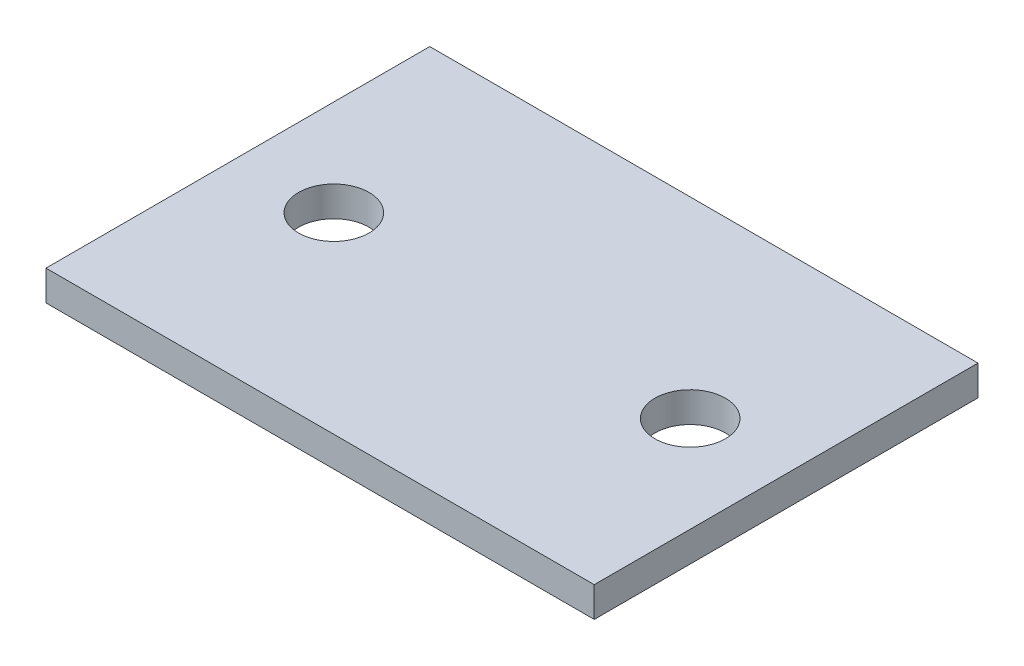
ISO-10303-21;
HEADER;
FILE_DESCRIPTION(('STEP AP214'),'2;1');
FILE_NAME('part.step','',(''),(''),'','','');
FILE_SCHEMA(('AUTOMOTIVE_DESIGN { 1 0 10303 214 1 1 1 1 }'));
ENDSEC;
DATA;
#1=APPLICATION_CONTEXT('core data for automotive mechanical design processes');
#2=APPLICATION_PROTOCOL_DEFINITION('international standard','automotive_design',2000,#1);
#3=PRODUCT_CONTEXT('',#1,'mechanical');
#4=PRODUCT('Part','Part','',(#3));
#5=PRODUCT_RELATED_PRODUCT_CATEGORY('part','',(#4));
#6=PRODUCT_DEFINITION_FORMATION('','',#4);
#7=PRODUCT_DEFINITION_CONTEXT('part definition',#1,'design');
#8=PRODUCT_DEFINITION('design','',#6,#7);
#9=PRODUCT_DEFINITION_SHAPE('','',#8);
#10=(LENGTH_UNIT() NAMED_UNIT(*) SI_UNIT(.MILLI.,.METRE.));
#11=(NAMED_UNIT(*) PLANE_ANGLE_UNIT() SI_UNIT($,.RADIAN.));
#12=(NAMED_UNIT(*) SI_UNIT($,.STERADIAN.) SOLID_ANGLE_UNIT());
#13=UNCERTAINTY_MEASURE_WITH_UNIT(LENGTH_MEASURE(1.E-05),#10,'distance_accuracy_value','');
#14=(GEOMETRIC_REPRESENTATION_CONTEXT(3) GLOBAL_UNCERTAINTY_ASSIGNED_CONTEXT((#13)) GLOBAL_UNIT_ASSIGNED_CONTEXT((#10,
#11,#12)) REPRESENTATION_CONTEXT('',''));
#15=CARTESIAN_POINT('',(0.,0.,0.));
#16=DIRECTION('',(0.,0.,1.));
#17=DIRECTION('',(1.,0.,0.));
#18=AXIS2_PLACEMENT_3D('',#15,#16,#17);
#19=CARTESIAN_POINT('',(0.,2.794,0.));
#20=DIRECTION('',(0.,1.,0.));
#21=DIRECTION('',(0.,0.,1.));
#22=AXIS2_PLACEMENT_3D('',#19,#20,#21);
#23=PLANE('',#22);
#24=CARTESIAN_POINT('',(-16.51,2.794,0.));
#25=DIRECTION('',(0.,1.,0.));
#26=DIRECTION('',(0.,0.,1.));
#27=AXIS2_PLACEMENT_3D('',#24,#25,#26);
#28=CIRCLE('',#27,3.2639);
#29=CARTESIAN_POINT('',(-16.51,2.794,3.2639));
#30=VERTEX_POINT('',#29);
#31=EDGE_CURVE('E124',#30,#30,#28,.T.);
#32=ORIENTED_EDGE('',*,*,#31,.F.);
#33=EDGE_LOOP('',(#32));
#34=FACE_BOUND('',#33,.T.);
#35=DIRECTION('',(0.,0.,1.));
#36=VECTOR('',#35,1.);
#37=CARTESIAN_POINT('',(-25.4,2.794,-17.78));
#38=LINE('',#37,#36);
#39=CARTESIAN_POINT('',(-25.4,2.794,-17.78));
#40=VERTEX_POINT('',#39);
#41=CARTESIAN_POINT('',(-25.4,2.794,17.78));
#42=VERTEX_POINT('',#41);
#43=EDGE_CURVE('E102',#40,#42,#38,.T.);
#44=ORIENTED_EDGE('',*,*,#43,.T.);
#45=DIRECTION('',(1.,0.,0.));
#46=VECTOR('',#45,1.);
#47=CARTESIAN_POINT('',(-25.4,2.794,17.78));
#48=LINE('',#47,#46);
#49=CARTESIAN_POINT('',(25.4,2.794,17.78));
#50=VERTEX_POINT('',#49);
#51=EDGE_CURVE('E97',#42,#50,#48,.T.);
#52=ORIENTED_EDGE('',*,*,#51,.T.);
#53=DIRECTION('',(0.,0.,-1.));
#54=VECTOR('',#53,1.);
#55=CARTESIAN_POINT('',(25.4,2.794,-17.78));
#56=LINE('',#55,#54);
#57=CARTESIAN_POINT('',(25.4,2.794,-17.78));
#58=VERTEX_POINT('',#57);
#59=EDGE_CURVE('E100',#50,#58,#56,.T.);
#60=ORIENTED_EDGE('',*,*,#59,.T.);
#61=DIRECTION('',(-1.,0.,0.));
#62=VECTOR('',#61,1.);
#63=CARTESIAN_POINT('',(-25.4,2.794,-17.78));
#64=LINE('',#63,#62);
#65=EDGE_CURVE('E67',#58,#40,#64,.T.);
#66=ORIENTED_EDGE('',*,*,#65,.T.);
#67=EDGE_LOOP('',(#44,#52,#60,#66));
#68=FACE_BOUND('',#67,.T.);
#69=CARTESIAN_POINT('',(16.51,2.794,0.));
#70=DIRECTION('',(0.,1.,0.));
#71=DIRECTION('',(0.,0.,-1.));
#72=AXIS2_PLACEMENT_3D('',#69,#70,#71);
#73=CIRCLE('',#72,3.2639);
#74=CARTESIAN_POINT('',(16.51,2.794,-3.2639));
#75=VERTEX_POINT('',#74);
#76=EDGE_CURVE('E137',#75,#75,#73,.T.);
#77=ORIENTED_EDGE('',*,*,#76,.F.);
#78=EDGE_LOOP('',(#77));
#79=FACE_BOUND('',#78,.T.);
#80=ADVANCED_FACE('F49',(#34,#68,#79),#23,.T.);
#81=CARTESIAN_POINT('',(0.,0.,0.));
#82=DIRECTION('',(0.,1.,0.));
#83=DIRECTION('',(0.,0.,1.));
#84=AXIS2_PLACEMENT_3D('',#81,#82,#83);
#85=PLANE('',#84);
#86=DIRECTION('',(0.,0.,1.));
#87=VECTOR('',#86,1.);
#88=CARTESIAN_POINT('',(-25.4,0.,-17.78));
#89=LINE('',#88,#87);
#90=CARTESIAN_POINT('',(-25.4,0.,-17.78));
#91=VERTEX_POINT('',#90);
#92=CARTESIAN_POINT('',(-25.4,0.,17.78));
#93=VERTEX_POINT('',#92);
#94=EDGE_CURVE('E120',#91,#93,#89,.T.);
#95=ORIENTED_EDGE('',*,*,#94,.F.);
#96=DIRECTION('',(-1.,0.,0.));
#97=VECTOR('',#96,1.);
#98=CARTESIAN_POINT('',(-25.4,0.,-17.78));
#99=LINE('',#98,#97);
#100=CARTESIAN_POINT('',(25.4,0.,-17.78));
#101=VERTEX_POINT('',#100);
#102=EDGE_CURVE('E90',#101,#91,#99,.T.);
#103=ORIENTED_EDGE('',*,*,#102,.F.);
#104=DIRECTION('',(0.,0.,-1.));
#105=VECTOR('',#104,1.);
#106=CARTESIAN_POINT('',(25.4,0.,-17.78));
#107=LINE('',#106,#105);
#108=CARTESIAN_POINT('',(25.4,0.,17.78));
#109=VERTEX_POINT('',#108);
#110=EDGE_CURVE('E84',#109,#101,#107,.T.);
#111=ORIENTED_EDGE('',*,*,#110,.F.);
#112=DIRECTION('',(1.,0.,0.));
#113=VECTOR('',#112,1.);
#114=CARTESIAN_POINT('',(-25.4,0.,17.78));
#115=LINE('',#114,#113);
#116=EDGE_CURVE('E107',#93,#109,#115,.T.);
#117=ORIENTED_EDGE('',*,*,#116,.F.);
#118=EDGE_LOOP('',(#95,#103,#111,#117));
#119=FACE_BOUND('',#118,.T.);
#120=CARTESIAN_POINT('',(-16.51,0.,0.));
#121=DIRECTION('',(0.,1.,0.));
#122=DIRECTION('',(0.,0.,1.));
#123=AXIS2_PLACEMENT_3D('',#120,#121,#122);
#124=CIRCLE('',#123,3.2639);
#125=CARTESIAN_POINT('',(-16.51,0.,3.2639));
#126=VERTEX_POINT('',#125);
#127=EDGE_CURVE('E134',#126,#126,#124,.T.);
#128=ORIENTED_EDGE('',*,*,#127,.T.);
#129=EDGE_LOOP('',(#128));
#130=FACE_BOUND('',#129,.T.);
#131=CARTESIAN_POINT('',(16.51,0.,0.));
#132=DIRECTION('',(0.,1.,0.));
#133=DIRECTION('',(0.,0.,-1.));
#134=AXIS2_PLACEMENT_3D('',#131,#132,#133);
#135=CIRCLE('',#134,3.2639);
#136=CARTESIAN_POINT('',(16.51,0.,-3.2639));
#137=VERTEX_POINT('',#136);
#138=EDGE_CURVE('E142',#137,#137,#135,.T.);
#139=ORIENTED_EDGE('',*,*,#138,.T.);
#140=EDGE_LOOP('',(#139));
#141=FACE_BOUND('',#140,.T.);
#142=ADVANCED_FACE('F153',(#119,#130,#141),#85,.F.);
#143=CARTESIAN_POINT('',(-25.4,2.794,-17.78));
#144=DIRECTION('',(1.,0.,0.));
#145=DIRECTION('',(0.,0.,-1.));
#146=AXIS2_PLACEMENT_3D('',#143,#144,#145);
#147=PLANE('',#146);
#148=ORIENTED_EDGE('',*,*,#94,.T.);
#149=DIRECTION('',(0.,-1.,0.));
#150=VECTOR('',#149,1.);
#151=CARTESIAN_POINT('',(-25.4,2.794,17.78));
#152=LINE('',#151,#150);
#153=EDGE_CURVE('E12',#42,#93,#152,.T.);
#154=ORIENTED_EDGE('',*,*,#153,.F.);
#155=ORIENTED_EDGE('',*,*,#43,.F.);
#156=DIRECTION('',(0.,-1.,0.));
#157=VECTOR('',#156,1.);
#158=CARTESIAN_POINT('',(-25.4,2.794,-17.78));
#159=LINE('',#158,#157);
#160=EDGE_CURVE('E115',#40,#91,#159,.T.);
#161=ORIENTED_EDGE('',*,*,#160,.T.);
#162=EDGE_LOOP('',(#148,#154,#155,#161));
#163=FACE_BOUND('',#162,.T.);
#164=ADVANCED_FACE('F51',(#163),#147,.F.);
#165=CARTESIAN_POINT('',(-25.4,2.794,17.78));
#166=DIRECTION('',(0.,0.,-1.));
#167=DIRECTION('',(-1.,0.,0.));
#168=AXIS2_PLACEMENT_3D('',#165,#166,#167);
#169=PLANE('',#168);
#170=ORIENTED_EDGE('',*,*,#116,.T.);
#171=DIRECTION('',(0.,-1.,0.));
#172=VECTOR('',#171,1.);
#173=CARTESIAN_POINT('',(25.4,2.794,17.78));
#174=LINE('',#173,#172);
#175=EDGE_CURVE('E59',#50,#109,#174,.T.);
#176=ORIENTED_EDGE('',*,*,#175,.F.);
#177=ORIENTED_EDGE('',*,*,#51,.F.);
#178=ORIENTED_EDGE('',*,*,#153,.T.);
#179=EDGE_LOOP('',(#170,#176,#177,#178));
#180=FACE_BOUND('',#179,.T.);
#181=ADVANCED_FACE('F106',(#180),#169,.F.);
#182=CARTESIAN_POINT('',(25.4,2.794,-17.78));
#183=DIRECTION('',(-1.,0.,0.));
#184=DIRECTION('',(0.,0.,1.));
#185=AXIS2_PLACEMENT_3D('',#182,#183,#184);
#186=PLANE('',#185);
#187=ORIENTED_EDGE('',*,*,#110,.T.);
#188=DIRECTION('',(0.,-1.,0.));
#189=VECTOR('',#188,1.);
#190=CARTESIAN_POINT('',(25.4,2.794,-17.78));
#191=LINE('',#190,#189);
#192=EDGE_CURVE('E109',#58,#101,#191,.T.);
#193=ORIENTED_EDGE('',*,*,#192,.F.);
#194=ORIENTED_EDGE('',*,*,#59,.F.);
#195=ORIENTED_EDGE('',*,*,#175,.T.);
#196=EDGE_LOOP('',(#187,#193,#194,#195));
#197=FACE_BOUND('',#196,.T.);
#198=ADVANCED_FACE('F110',(#197),#186,.F.);
#199=CARTESIAN_POINT('',(-25.4,2.794,-17.78));
#200=DIRECTION('',(0.,0.,1.));
#201=DIRECTION('',(1.,0.,0.));
#202=AXIS2_PLACEMENT_3D('',#199,#200,#201);
#203=PLANE('',#202);
#204=ORIENTED_EDGE('',*,*,#102,.T.);
#205=ORIENTED_EDGE('',*,*,#160,.F.);
#206=ORIENTED_EDGE('',*,*,#65,.F.);
#207=ORIENTED_EDGE('',*,*,#192,.T.);
#208=EDGE_LOOP('',(#204,#205,#206,#207));
#209=FACE_BOUND('',#208,.T.);
#210=ADVANCED_FACE('F165',(#209),#203,.F.);
#211=CARTESIAN_POINT('',(-16.51,2.794,0.));
#212=DIRECTION('',(0.,-1.,0.));
#213=DIRECTION('',(0.,0.,-1.));
#214=AXIS2_PLACEMENT_3D('',#211,#212,#213);
#215=CYLINDRICAL_SURFACE('',#214,3.2639);
#216=ORIENTED_EDGE('',*,*,#31,.T.);
#217=EDGE_LOOP('',(#216));
#218=FACE_BOUND('',#217,.T.);
#219=ORIENTED_EDGE('',*,*,#127,.F.);
#220=EDGE_LOOP('',(#219));
#221=FACE_BOUND('',#220,.T.);
#222=ADVANCED_FACE('F162',(#218,#221),#215,.F.);
#223=CARTESIAN_POINT('',(16.51,2.794,0.));
#224=DIRECTION('',(0.,-1.,0.));
#225=DIRECTION('',(0.,0.,-1.));
#226=AXIS2_PLACEMENT_3D('',#223,#224,#225);
#227=CYLINDRICAL_SURFACE('',#226,3.2639);
#228=ORIENTED_EDGE('',*,*,#76,.T.);
#229=EDGE_LOOP('',(#228));
#230=FACE_BOUND('',#229,.T.);
#231=ORIENTED_EDGE('',*,*,#138,.F.);
#232=EDGE_LOOP('',(#231));
#233=FACE_BOUND('',#232,.T.);
#234=ADVANCED_FACE('F150',(#230,#233),#227,.F.);
#235=CLOSED_SHELL('',(#80,#142,#164,#181,#198,#210,#222,#234));
#236=MANIFOLD_SOLID_BREP('B2',#235);
#237=ADVANCED_BREP_SHAPE_REPRESENTATION('',(#18,#236),#14);
#238=SHAPE_DEFINITION_REPRESENTATION(#9,#237);
ENDSEC;
END-ISO-10303-21;
